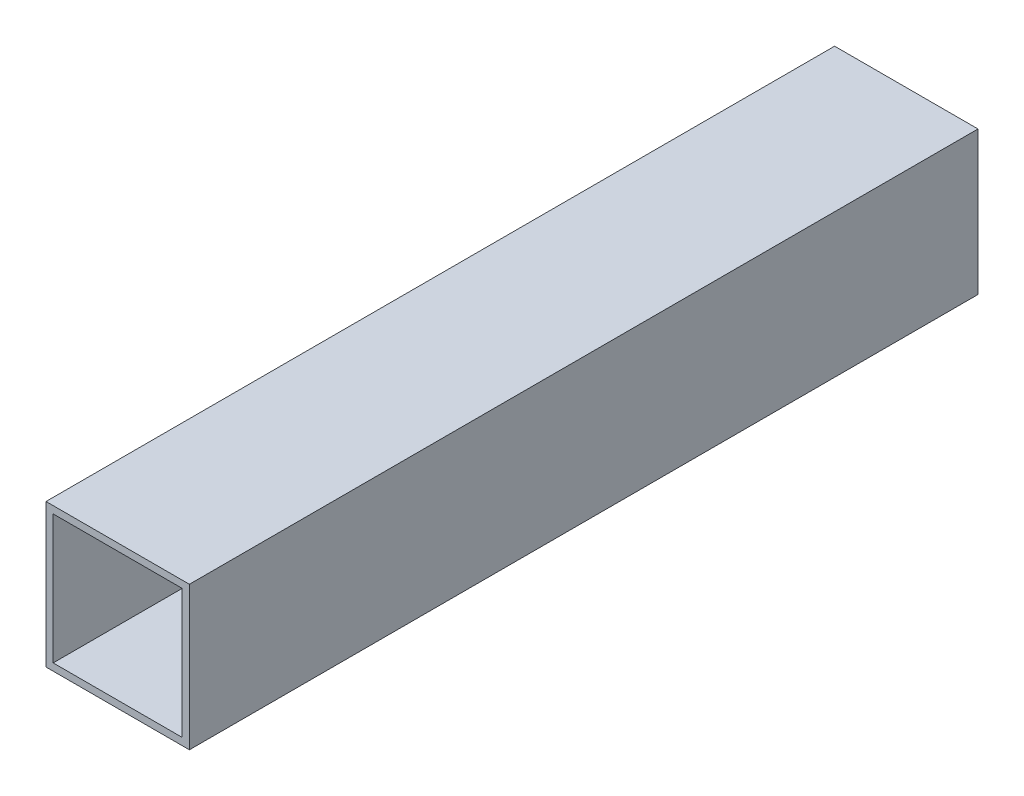
ISO-10303-21;
HEADER;
FILE_DESCRIPTION(('STEP AP214'),'2;1');
FILE_NAME('part.step','',(''),(''),'','','');
FILE_SCHEMA(('AUTOMOTIVE_DESIGN { 1 0 10303 214 1 1 1 1 }'));
ENDSEC;
DATA;
#1=APPLICATION_CONTEXT('core data for automotive mechanical design processes');
#2=APPLICATION_PROTOCOL_DEFINITION('international standard','automotive_design',2000,#1);
#3=PRODUCT_CONTEXT('',#1,'mechanical');
#4=PRODUCT('Part','Part','',(#3));
#5=PRODUCT_RELATED_PRODUCT_CATEGORY('part','',(#4));
#6=PRODUCT_DEFINITION_FORMATION('','',#4);
#7=PRODUCT_DEFINITION_CONTEXT('part definition',#1,'design');
#8=PRODUCT_DEFINITION('design','',#6,#7);
#9=PRODUCT_DEFINITION_SHAPE('','',#8);
#10=(LENGTH_UNIT() NAMED_UNIT(*) SI_UNIT(.MILLI.,.METRE.));
#11=(NAMED_UNIT(*) PLANE_ANGLE_UNIT() SI_UNIT($,.RADIAN.));
#12=(NAMED_UNIT(*) SI_UNIT($,.STERADIAN.) SOLID_ANGLE_UNIT());
#13=UNCERTAINTY_MEASURE_WITH_UNIT(LENGTH_MEASURE(1.E-05),#10,'distance_accuracy_value','');
#14=(GEOMETRIC_REPRESENTATION_CONTEXT(3) GLOBAL_UNCERTAINTY_ASSIGNED_CONTEXT((#13)) GLOBAL_UNIT_ASSIGNED_CONTEXT((#10,
#11,#12)) REPRESENTATION_CONTEXT('',''));
#15=CARTESIAN_POINT('',(0.,0.,0.));
#16=DIRECTION('',(0.,0.,1.));
#17=DIRECTION('',(1.,0.,0.));
#18=AXIS2_PLACEMENT_3D('',#15,#16,#17);
#19=CARTESIAN_POINT('',(-20.,-20.,220.));
#20=DIRECTION('',(0.,0.,1.));
#21=DIRECTION('',(1.,0.,0.));
#22=AXIS2_PLACEMENT_3D('',#19,#20,#21);
#23=PLANE('',#22);
#24=DIRECTION('',(0.,-1.,0.));
#25=VECTOR('',#24,1.);
#26=CARTESIAN_POINT('',(-20.,-20.,220.));
#27=LINE('',#26,#25);
#28=CARTESIAN_POINT('',(-20.,20.,220.));
#29=VERTEX_POINT('',#28);
#30=CARTESIAN_POINT('',(-20.,-20.,220.));
#31=VERTEX_POINT('',#30);
#32=EDGE_CURVE('E157',#29,#31,#27,.T.);
#33=ORIENTED_EDGE('',*,*,#32,.T.);
#34=DIRECTION('',(1.,0.,0.));
#35=VECTOR('',#34,1.);
#36=CARTESIAN_POINT('',(20.,-20.,220.));
#37=LINE('',#36,#35);
#38=CARTESIAN_POINT('',(20.,-20.,220.));
#39=VERTEX_POINT('',#38);
#40=EDGE_CURVE('E160',#31,#39,#37,.T.);
#41=ORIENTED_EDGE('',*,*,#40,.T.);
#42=DIRECTION('',(0.,1.,0.));
#43=VECTOR('',#42,1.);
#44=CARTESIAN_POINT('',(20.,-20.,220.));
#45=LINE('',#44,#43);
#46=CARTESIAN_POINT('',(20.,20.,220.));
#47=VERTEX_POINT('',#46);
#48=EDGE_CURVE('E163',#39,#47,#45,.T.);
#49=ORIENTED_EDGE('',*,*,#48,.T.);
#50=DIRECTION('',(-1.,0.,0.));
#51=VECTOR('',#50,1.);
#52=CARTESIAN_POINT('',(20.,20.,220.));
#53=LINE('',#52,#51);
#54=EDGE_CURVE('E165',#47,#29,#53,.T.);
#55=ORIENTED_EDGE('',*,*,#54,.T.);
#56=EDGE_LOOP('',(#33,#41,#49,#55));
#57=FACE_BOUND('',#56,.T.);
#58=DIRECTION('',(1.,0.,0.));
#59=VECTOR('',#58,1.);
#60=CARTESIAN_POINT('',(20.,-18.,220.));
#61=LINE('',#60,#59);
#62=CARTESIAN_POINT('',(-18.,-18.,220.));
#63=VERTEX_POINT('',#62);
#64=CARTESIAN_POINT('',(18.,-18.,220.));
#65=VERTEX_POINT('',#64);
#66=EDGE_CURVE('E129',#63,#65,#61,.T.);
#67=ORIENTED_EDGE('',*,*,#66,.F.);
#68=DIRECTION('',(0.,-1.,0.));
#69=VECTOR('',#68,1.);
#70=CARTESIAN_POINT('',(-18.,-20.,220.));
#71=LINE('',#70,#69);
#72=CARTESIAN_POINT('',(-18.,18.,220.));
#73=VERTEX_POINT('',#72);
#74=EDGE_CURVE('E121',#73,#63,#71,.T.);
#75=ORIENTED_EDGE('',*,*,#74,.F.);
#76=DIRECTION('',(-1.,0.,0.));
#77=VECTOR('',#76,1.);
#78=CARTESIAN_POINT('',(20.,18.,220.));
#79=LINE('',#78,#77);
#80=CARTESIAN_POINT('',(18.,18.,220.));
#81=VERTEX_POINT('',#80);
#82=EDGE_CURVE('E143',#81,#73,#79,.T.);
#83=ORIENTED_EDGE('',*,*,#82,.F.);
#84=DIRECTION('',(0.,1.,0.));
#85=VECTOR('',#84,1.);
#86=CARTESIAN_POINT('',(18.,-20.,220.));
#87=LINE('',#86,#85);
#88=EDGE_CURVE('E141',#65,#81,#87,.T.);
#89=ORIENTED_EDGE('',*,*,#88,.F.);
#90=EDGE_LOOP('',(#67,#75,#83,#89));
#91=FACE_BOUND('',#90,.T.);
#92=ADVANCED_FACE('F56',(#57,#91),#23,.T.);
#93=CARTESIAN_POINT('',(-20.,-20.,0.));
#94=DIRECTION('',(0.,0.,1.));
#95=DIRECTION('',(1.,0.,0.));
#96=AXIS2_PLACEMENT_3D('',#93,#94,#95);
#97=PLANE('',#96);
#98=DIRECTION('',(0.,-1.,0.));
#99=VECTOR('',#98,1.);
#100=CARTESIAN_POINT('',(-20.,-20.,0.));
#101=LINE('',#100,#99);
#102=CARTESIAN_POINT('',(-20.,20.,0.));
#103=VERTEX_POINT('',#102);
#104=CARTESIAN_POINT('',(-20.,-20.,0.));
#105=VERTEX_POINT('',#104);
#106=EDGE_CURVE('E137',#103,#105,#101,.T.);
#107=ORIENTED_EDGE('',*,*,#106,.F.);
#108=DIRECTION('',(-1.,0.,0.));
#109=VECTOR('',#108,1.);
#110=CARTESIAN_POINT('',(20.,20.,0.));
#111=LINE('',#110,#109);
#112=CARTESIAN_POINT('',(20.,20.,0.));
#113=VERTEX_POINT('',#112);
#114=EDGE_CURVE('E161',#113,#103,#111,.T.);
#115=ORIENTED_EDGE('',*,*,#114,.F.);
#116=DIRECTION('',(0.,1.,0.));
#117=VECTOR('',#116,1.);
#118=CARTESIAN_POINT('',(20.,-20.,0.));
#119=LINE('',#118,#117);
#120=CARTESIAN_POINT('',(20.,-20.,0.));
#121=VERTEX_POINT('',#120);
#122=EDGE_CURVE('E172',#121,#113,#119,.T.);
#123=ORIENTED_EDGE('',*,*,#122,.F.);
#124=DIRECTION('',(1.,0.,0.));
#125=VECTOR('',#124,1.);
#126=CARTESIAN_POINT('',(20.,-20.,0.));
#127=LINE('',#126,#125);
#128=EDGE_CURVE('E170',#105,#121,#127,.T.);
#129=ORIENTED_EDGE('',*,*,#128,.F.);
#130=EDGE_LOOP('',(#107,#115,#123,#129));
#131=FACE_BOUND('',#130,.T.);
#132=DIRECTION('',(0.,-1.,0.));
#133=VECTOR('',#132,1.);
#134=CARTESIAN_POINT('',(-18.,-20.,0.));
#135=LINE('',#134,#133);
#136=CARTESIAN_POINT('',(-18.,18.,0.));
#137=VERTEX_POINT('',#136);
#138=CARTESIAN_POINT('',(-18.,-18.,0.));
#139=VERTEX_POINT('',#138);
#140=EDGE_CURVE('E79',#137,#139,#135,.T.);
#141=ORIENTED_EDGE('',*,*,#140,.T.);
#142=DIRECTION('',(1.,0.,0.));
#143=VECTOR('',#142,1.);
#144=CARTESIAN_POINT('',(20.,-18.,0.));
#145=LINE('',#144,#143);
#146=CARTESIAN_POINT('',(18.,-18.,0.));
#147=VERTEX_POINT('',#146);
#148=EDGE_CURVE('E136',#139,#147,#145,.T.);
#149=ORIENTED_EDGE('',*,*,#148,.T.);
#150=DIRECTION('',(0.,1.,0.));
#151=VECTOR('',#150,1.);
#152=CARTESIAN_POINT('',(18.,-20.,0.));
#153=LINE('',#152,#151);
#154=CARTESIAN_POINT('',(18.,18.,0.));
#155=VERTEX_POINT('',#154);
#156=EDGE_CURVE('E149',#147,#155,#153,.T.);
#157=ORIENTED_EDGE('',*,*,#156,.T.);
#158=DIRECTION('',(-1.,0.,0.));
#159=VECTOR('',#158,1.);
#160=CARTESIAN_POINT('',(20.,18.,0.));
#161=LINE('',#160,#159);
#162=EDGE_CURVE('E130',#155,#137,#161,.T.);
#163=ORIENTED_EDGE('',*,*,#162,.T.);
#164=EDGE_LOOP('',(#141,#149,#157,#163));
#165=FACE_BOUND('',#164,.T.);
#166=ADVANCED_FACE('F190',(#131,#165),#97,.F.);
#167=CARTESIAN_POINT('',(-20.,-20.,220.));
#168=DIRECTION('',(1.,0.,0.));
#169=DIRECTION('',(0.,0.,-1.));
#170=AXIS2_PLACEMENT_3D('',#167,#168,#169);
#171=PLANE('',#170);
#172=ORIENTED_EDGE('',*,*,#106,.T.);
#173=DIRECTION('',(0.,0.,-1.));
#174=VECTOR('',#173,1.);
#175=CARTESIAN_POINT('',(-20.,-20.,220.));
#176=LINE('',#175,#174);
#177=EDGE_CURVE('E12',#31,#105,#176,.T.);
#178=ORIENTED_EDGE('',*,*,#177,.F.);
#179=ORIENTED_EDGE('',*,*,#32,.F.);
#180=DIRECTION('',(0.,0.,-1.));
#181=VECTOR('',#180,1.);
#182=CARTESIAN_POINT('',(-20.,20.,220.));
#183=LINE('',#182,#181);
#184=EDGE_CURVE('E167',#29,#103,#183,.T.);
#185=ORIENTED_EDGE('',*,*,#184,.T.);
#186=EDGE_LOOP('',(#172,#178,#179,#185));
#187=FACE_BOUND('',#186,.T.);
#188=ADVANCED_FACE('F58',(#187),#171,.F.);
#189=CARTESIAN_POINT('',(20.,-20.,220.));
#190=DIRECTION('',(0.,1.,0.));
#191=DIRECTION('',(-1.,0.,0.));
#192=AXIS2_PLACEMENT_3D('',#189,#190,#191);
#193=PLANE('',#192);
#194=ORIENTED_EDGE('',*,*,#128,.T.);
#195=DIRECTION('',(0.,0.,-1.));
#196=VECTOR('',#195,1.);
#197=CARTESIAN_POINT('',(20.,-20.,220.));
#198=LINE('',#197,#196);
#199=EDGE_CURVE('E64',#39,#121,#198,.T.);
#200=ORIENTED_EDGE('',*,*,#199,.F.);
#201=ORIENTED_EDGE('',*,*,#40,.F.);
#202=ORIENTED_EDGE('',*,*,#177,.T.);
#203=EDGE_LOOP('',(#194,#200,#201,#202));
#204=FACE_BOUND('',#203,.T.);
#205=ADVANCED_FACE('F200',(#204),#193,.F.);
#206=CARTESIAN_POINT('',(20.,-20.,220.));
#207=DIRECTION('',(-1.,0.,0.));
#208=DIRECTION('',(0.,0.,1.));
#209=AXIS2_PLACEMENT_3D('',#206,#207,#208);
#210=PLANE('',#209);
#211=ORIENTED_EDGE('',*,*,#122,.T.);
#212=DIRECTION('',(0.,0.,-1.));
#213=VECTOR('',#212,1.);
#214=CARTESIAN_POINT('',(20.,20.,220.));
#215=LINE('',#214,#213);
#216=EDGE_CURVE('E177',#47,#113,#215,.T.);
#217=ORIENTED_EDGE('',*,*,#216,.F.);
#218=ORIENTED_EDGE('',*,*,#48,.F.);
#219=ORIENTED_EDGE('',*,*,#199,.T.);
#220=EDGE_LOOP('',(#211,#217,#218,#219));
#221=FACE_BOUND('',#220,.T.);
#222=ADVANCED_FACE('F184',(#221),#210,.F.);
#223=CARTESIAN_POINT('',(20.,20.,220.));
#224=DIRECTION('',(0.,-1.,0.));
#225=DIRECTION('',(1.,0.,0.));
#226=AXIS2_PLACEMENT_3D('',#223,#224,#225);
#227=PLANE('',#226);
#228=ORIENTED_EDGE('',*,*,#114,.T.);
#229=ORIENTED_EDGE('',*,*,#184,.F.);
#230=ORIENTED_EDGE('',*,*,#54,.F.);
#231=ORIENTED_EDGE('',*,*,#216,.T.);
#232=EDGE_LOOP('',(#228,#229,#230,#231));
#233=FACE_BOUND('',#232,.T.);
#234=ADVANCED_FACE('F194',(#233),#227,.F.);
#235=CARTESIAN_POINT('',(-18.,-20.,220.));
#236=DIRECTION('',(1.,0.,0.));
#237=DIRECTION('',(0.,0.,-1.));
#238=AXIS2_PLACEMENT_3D('',#235,#236,#237);
#239=PLANE('',#238);
#240=ORIENTED_EDGE('',*,*,#140,.F.);
#241=DIRECTION('',(0.,0.,-1.));
#242=VECTOR('',#241,1.);
#243=CARTESIAN_POINT('',(-18.,18.,220.));
#244=LINE('',#243,#242);
#245=EDGE_CURVE('E125',#73,#137,#244,.T.);
#246=ORIENTED_EDGE('',*,*,#245,.F.);
#247=ORIENTED_EDGE('',*,*,#74,.T.);
#248=DIRECTION('',(0.,0.,-1.));
#249=VECTOR('',#248,1.);
#250=CARTESIAN_POINT('',(-18.,-18.,220.));
#251=LINE('',#250,#249);
#252=EDGE_CURVE('E124',#63,#139,#251,.T.);
#253=ORIENTED_EDGE('',*,*,#252,.T.);
#254=EDGE_LOOP('',(#240,#246,#247,#253));
#255=FACE_BOUND('',#254,.T.);
#256=ADVANCED_FACE('F123',(#255),#239,.T.);
#257=CARTESIAN_POINT('',(20.,-18.,220.));
#258=DIRECTION('',(0.,1.,0.));
#259=DIRECTION('',(-1.,0.,0.));
#260=AXIS2_PLACEMENT_3D('',#257,#258,#259);
#261=PLANE('',#260);
#262=ORIENTED_EDGE('',*,*,#148,.F.);
#263=ORIENTED_EDGE('',*,*,#252,.F.);
#264=ORIENTED_EDGE('',*,*,#66,.T.);
#265=DIRECTION('',(0.,0.,-1.));
#266=VECTOR('',#265,1.);
#267=CARTESIAN_POINT('',(18.,-18.,220.));
#268=LINE('',#267,#266);
#269=EDGE_CURVE('E138',#65,#147,#268,.T.);
#270=ORIENTED_EDGE('',*,*,#269,.T.);
#271=EDGE_LOOP('',(#262,#263,#264,#270));
#272=FACE_BOUND('',#271,.T.);
#273=ADVANCED_FACE('F133',(#272),#261,.T.);
#274=CARTESIAN_POINT('',(18.,-20.,220.));
#275=DIRECTION('',(-1.,0.,0.));
#276=DIRECTION('',(0.,0.,1.));
#277=AXIS2_PLACEMENT_3D('',#274,#275,#276);
#278=PLANE('',#277);
#279=ORIENTED_EDGE('',*,*,#156,.F.);
#280=ORIENTED_EDGE('',*,*,#269,.F.);
#281=ORIENTED_EDGE('',*,*,#88,.T.);
#282=DIRECTION('',(0.,0.,-1.));
#283=VECTOR('',#282,1.);
#284=CARTESIAN_POINT('',(18.,18.,220.));
#285=LINE('',#284,#283);
#286=EDGE_CURVE('E71',#81,#155,#285,.T.);
#287=ORIENTED_EDGE('',*,*,#286,.T.);
#288=EDGE_LOOP('',(#279,#280,#281,#287));
#289=FACE_BOUND('',#288,.T.);
#290=ADVANCED_FACE('F223',(#289),#278,.T.);
#291=CARTESIAN_POINT('',(20.,18.,220.));
#292=DIRECTION('',(0.,-1.,0.));
#293=DIRECTION('',(1.,0.,0.));
#294=AXIS2_PLACEMENT_3D('',#291,#292,#293);
#295=PLANE('',#294);
#296=ORIENTED_EDGE('',*,*,#162,.F.);
#297=ORIENTED_EDGE('',*,*,#286,.F.);
#298=ORIENTED_EDGE('',*,*,#82,.T.);
#299=ORIENTED_EDGE('',*,*,#245,.T.);
#300=EDGE_LOOP('',(#296,#297,#298,#299));
#301=FACE_BOUND('',#300,.T.);
#302=ADVANCED_FACE('F227',(#301),#295,.T.);
#303=CLOSED_SHELL('',(#92,#166,#188,#205,#222,#234,#256,#273,#290,#302));
#304=MANIFOLD_SOLID_BREP('B2',#303);
#305=ADVANCED_BREP_SHAPE_REPRESENTATION('',(#18,#304),#14);
#306=SHAPE_DEFINITION_REPRESENTATION(#9,#305);
ENDSEC;
END-ISO-10303-21;
